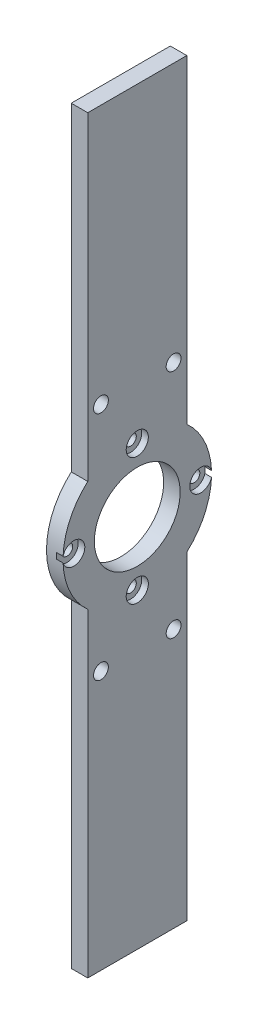
ISO-10303-21;
HEADER;
FILE_DESCRIPTION(('STEP AP214'),'2;1');
FILE_NAME('part.step','',(''),(''),'','','');
FILE_SCHEMA(('AUTOMOTIVE_DESIGN { 1 0 10303 214 1 1 1 1 }'));
ENDSEC;
DATA;
#1=APPLICATION_CONTEXT('core data for automotive mechanical design processes');
#2=APPLICATION_PROTOCOL_DEFINITION('international standard','automotive_design',2000,#1);
#3=PRODUCT_CONTEXT('',#1,'mechanical');
#4=PRODUCT('Part','Part','',(#3));
#5=PRODUCT_RELATED_PRODUCT_CATEGORY('part','',(#4));
#6=PRODUCT_DEFINITION_FORMATION('','',#4);
#7=PRODUCT_DEFINITION_CONTEXT('part definition',#1,'design');
#8=PRODUCT_DEFINITION('design','',#6,#7);
#9=PRODUCT_DEFINITION_SHAPE('','',#8);
#10=(LENGTH_UNIT() NAMED_UNIT(*) SI_UNIT(.MILLI.,.METRE.));
#11=(NAMED_UNIT(*) PLANE_ANGLE_UNIT() SI_UNIT($,.RADIAN.));
#12=(NAMED_UNIT(*) SI_UNIT($,.STERADIAN.) SOLID_ANGLE_UNIT());
#13=UNCERTAINTY_MEASURE_WITH_UNIT(LENGTH_MEASURE(1.E-05),#10,'distance_accuracy_value','');
#14=(GEOMETRIC_REPRESENTATION_CONTEXT(3) GLOBAL_UNCERTAINTY_ASSIGNED_CONTEXT((#13)) GLOBAL_UNIT_ASSIGNED_CONTEXT((#10,
#11,#12)) REPRESENTATION_CONTEXT('',''));
#15=CARTESIAN_POINT('',(0.,0.,0.));
#16=DIRECTION('',(0.,0.,1.));
#17=DIRECTION('',(1.,0.,0.));
#18=AXIS2_PLACEMENT_3D('',#15,#16,#17);
#19=CARTESIAN_POINT('',(0.,227.,30.));
#20=DIRECTION('',(0.,0.,-1.));
#21=DIRECTION('',(-1.,0.,0.));
#22=AXIS2_PLACEMENT_3D('',#19,#20,#21);
#23=PLANE('',#22);
#24=DIRECTION('',(0.,-1.,0.));
#25=VECTOR('',#24,1.);
#26=CARTESIAN_POINT('',(5.,227.,30.));
#27=LINE('',#26,#25);
#28=CARTESIAN_POINT('',(5.,96.7294901687516,30.));
#29=VERTEX_POINT('',#28);
#30=CARTESIAN_POINT('',(5.,0.,30.));
#31=VERTEX_POINT('',#30);
#32=EDGE_CURVE('E157',#29,#31,#27,.T.);
#33=ORIENTED_EDGE('',*,*,#32,.F.);
#34=DIRECTION('',(-1.,0.,0.));
#35=VECTOR('',#34,1.);
#36=CARTESIAN_POINT('',(68.6396103067893,96.7294901687516,30.));
#37=LINE('',#36,#35);
#38=CARTESIAN_POINT('',(0.,96.7294901687516,30.));
#39=VERTEX_POINT('',#38);
#40=EDGE_CURVE('E179',#29,#39,#37,.T.);
#41=ORIENTED_EDGE('',*,*,#40,.T.);
#42=DIRECTION('',(0.,-1.,0.));
#43=VECTOR('',#42,1.);
#44=CARTESIAN_POINT('',(0.,227.,30.));
#45=LINE('',#44,#43);
#46=CARTESIAN_POINT('',(0.,0.,30.));
#47=VERTEX_POINT('',#46);
#48=EDGE_CURVE('E153',#39,#47,#45,.T.);
#49=ORIENTED_EDGE('',*,*,#48,.T.);
#50=DIRECTION('',(1.,0.,0.));
#51=VECTOR('',#50,1.);
#52=CARTESIAN_POINT('',(0.,0.,30.));
#53=LINE('',#52,#51);
#54=EDGE_CURVE('E173',#47,#31,#53,.T.);
#55=ORIENTED_EDGE('',*,*,#54,.T.);
#56=EDGE_LOOP('',(#33,#41,#49,#55));
#57=FACE_BOUND('',#56,.T.);
#58=ADVANCED_FACE('F35',(#57),#23,.F.);
#59=CARTESIAN_POINT('',(0.,227.,0.));
#60=DIRECTION('',(0.,0.,1.));
#61=DIRECTION('',(1.,0.,0.));
#62=AXIS2_PLACEMENT_3D('',#59,#60,#61);
#63=PLANE('',#62);
#64=DIRECTION('',(0.,-1.,0.));
#65=VECTOR('',#64,1.);
#66=CARTESIAN_POINT('',(5.,227.,0.));
#67=LINE('',#66,#65);
#68=CARTESIAN_POINT('',(5.,227.,0.));
#69=VERTEX_POINT('',#68);
#70=CARTESIAN_POINT('',(5.,130.270509831248,0.));
#71=VERTEX_POINT('',#70);
#72=EDGE_CURVE('E158',#69,#71,#67,.T.);
#73=ORIENTED_EDGE('',*,*,#72,.T.);
#74=DIRECTION('',(-1.,0.,0.));
#75=VECTOR('',#74,1.);
#76=CARTESIAN_POINT('',(68.6396103067893,130.270509831248,0.));
#77=LINE('',#76,#75);
#78=CARTESIAN_POINT('',(0.,130.270509831248,0.));
#79=VERTEX_POINT('',#78);
#80=EDGE_CURVE('E145',#71,#79,#77,.T.);
#81=ORIENTED_EDGE('',*,*,#80,.T.);
#82=DIRECTION('',(0.,-1.,0.));
#83=VECTOR('',#82,1.);
#84=CARTESIAN_POINT('',(0.,227.,0.));
#85=LINE('',#84,#83);
#86=CARTESIAN_POINT('',(0.,227.,0.));
#87=VERTEX_POINT('',#86);
#88=EDGE_CURVE('E162',#87,#79,#85,.T.);
#89=ORIENTED_EDGE('',*,*,#88,.F.);
#90=DIRECTION('',(-1.,0.,0.));
#91=VECTOR('',#90,1.);
#92=CARTESIAN_POINT('',(0.,227.,0.));
#93=LINE('',#92,#91);
#94=EDGE_CURVE('E180',#69,#87,#93,.T.);
#95=ORIENTED_EDGE('',*,*,#94,.F.);
#96=EDGE_LOOP('',(#73,#81,#89,#95));
#97=FACE_BOUND('',#96,.T.);
#98=ADVANCED_FACE('F326',(#97),#63,.F.);
#99=CARTESIAN_POINT('',(0.,227.,0.));
#100=DIRECTION('',(1.,0.,0.));
#101=DIRECTION('',(0.,0.,-1.));
#102=AXIS2_PLACEMENT_3D('',#99,#100,#101);
#103=PLANE('',#102);
#104=CARTESIAN_POINT('',(0.,148.5,26.));
#105=DIRECTION('',(1.,0.,0.));
#106=DIRECTION('',(0.,0.,-1.));
#107=AXIS2_PLACEMENT_3D('',#104,#105,#106);
#108=CIRCLE('',#107,2.25);
#109=CARTESIAN_POINT('',(0.,148.5,23.75));
#110=VERTEX_POINT('',#109);
#111=EDGE_CURVE('E266',#110,#110,#108,.T.);
#112=ORIENTED_EDGE('',*,*,#111,.T.);
#113=EDGE_LOOP('',(#112));
#114=FACE_BOUND('',#113,.T.);
#115=CARTESIAN_POINT('',(0.,148.5,4.));
#116=DIRECTION('',(1.,0.,0.));
#117=DIRECTION('',(0.,0.,-1.));
#118=AXIS2_PLACEMENT_3D('',#115,#116,#117);
#119=CIRCLE('',#118,2.25);
#120=CARTESIAN_POINT('',(0.,148.5,1.75));
#121=VERTEX_POINT('',#120);
#122=EDGE_CURVE('E260',#121,#121,#119,.T.);
#123=ORIENTED_EDGE('',*,*,#122,.T.);
#124=EDGE_LOOP('',(#123));
#125=FACE_BOUND('',#124,.T.);
#126=CARTESIAN_POINT('',(0.,78.5,4.));
#127=DIRECTION('',(1.,0.,0.));
#128=DIRECTION('',(0.,0.,-1.));
#129=AXIS2_PLACEMENT_3D('',#126,#127,#128);
#130=CIRCLE('',#129,2.25);
#131=CARTESIAN_POINT('',(0.,78.5,1.75));
#132=VERTEX_POINT('',#131);
#133=EDGE_CURVE('E254',#132,#132,#130,.T.);
#134=ORIENTED_EDGE('',*,*,#133,.T.);
#135=EDGE_LOOP('',(#134));
#136=FACE_BOUND('',#135,.T.);
#137=CARTESIAN_POINT('',(0.,78.5,26.));
#138=DIRECTION('',(1.,0.,0.));
#139=DIRECTION('',(0.,0.,-1.));
#140=AXIS2_PLACEMENT_3D('',#137,#138,#139);
#141=CIRCLE('',#140,2.25);
#142=CARTESIAN_POINT('',(0.,78.5,23.75));
#143=VERTEX_POINT('',#142);
#144=EDGE_CURVE('E248',#143,#143,#141,.T.);
#145=ORIENTED_EDGE('',*,*,#144,.T.);
#146=EDGE_LOOP('',(#145));
#147=FACE_BOUND('',#146,.T.);
#148=CARTESIAN_POINT('',(0.,132.75,15.));
#149=DIRECTION('',(1.,0.,0.));
#150=DIRECTION('',(0.,0.,-1.));
#151=AXIS2_PLACEMENT_3D('',#148,#149,#150);
#152=CIRCLE('',#151,1.70000000000001);
#153=CARTESIAN_POINT('',(0.,132.75,13.3));
#154=VERTEX_POINT('',#153);
#155=EDGE_CURVE('E236',#154,#154,#152,.T.);
#156=ORIENTED_EDGE('',*,*,#155,.T.);
#157=EDGE_LOOP('',(#156));
#158=FACE_BOUND('',#157,.T.);
#159=CARTESIAN_POINT('',(0.,113.5,-4.25));
#160=DIRECTION('',(1.,0.,0.));
#161=DIRECTION('',(0.,0.,-1.));
#162=AXIS2_PLACEMENT_3D('',#159,#160,#161);
#163=CIRCLE('',#162,1.69999999999999);
#164=CARTESIAN_POINT('',(0.,113.5,-5.95));
#165=VERTEX_POINT('',#164);
#166=EDGE_CURVE('E230',#165,#165,#163,.T.);
#167=ORIENTED_EDGE('',*,*,#166,.T.);
#168=EDGE_LOOP('',(#167));
#169=FACE_BOUND('',#168,.T.);
#170=CARTESIAN_POINT('',(0.,94.25,15.));
#171=DIRECTION('',(1.,0.,0.));
#172=DIRECTION('',(0.,0.,-1.));
#173=AXIS2_PLACEMENT_3D('',#170,#171,#172);
#174=CIRCLE('',#173,1.69999999999999);
#175=CARTESIAN_POINT('',(0.,94.25,13.3));
#176=VERTEX_POINT('',#175);
#177=EDGE_CURVE('E218',#176,#176,#174,.T.);
#178=ORIENTED_EDGE('',*,*,#177,.T.);
#179=EDGE_LOOP('',(#178));
#180=FACE_BOUND('',#179,.T.);
#181=CARTESIAN_POINT('',(0.,113.5,34.25));
#182=DIRECTION('',(1.,0.,0.));
#183=DIRECTION('',(0.,0.,-1.));
#184=AXIS2_PLACEMENT_3D('',#181,#182,#183);
#185=CIRCLE('',#184,1.69999999999999);
#186=CARTESIAN_POINT('',(0.,113.5,32.55));
#187=VERTEX_POINT('',#186);
#188=EDGE_CURVE('E207',#187,#187,#185,.T.);
#189=ORIENTED_EDGE('',*,*,#188,.T.);
#190=EDGE_LOOP('',(#189));
#191=FACE_BOUND('',#190,.T.);
#192=CARTESIAN_POINT('',(0.,113.5,15.));
#193=DIRECTION('',(-1.,0.,0.));
#194=DIRECTION('',(0.,0.,1.));
#195=AXIS2_PLACEMENT_3D('',#192,#193,#194);
#196=CIRCLE('',#195,13.);
#197=CARTESIAN_POINT('',(0.,113.5,28.));
#198=VERTEX_POINT('',#197);
#199=EDGE_CURVE('E204',#198,#198,#196,.T.);
#200=ORIENTED_EDGE('',*,*,#199,.F.);
#201=EDGE_LOOP('',(#200));
#202=FACE_BOUND('',#201,.T.);
#203=ORIENTED_EDGE('',*,*,#48,.F.);
#204=CARTESIAN_POINT('',(0.,113.5,15.));
#205=DIRECTION('',(-1.,0.,0.));
#206=DIRECTION('',(0.,0.,1.));
#207=AXIS2_PLACEMENT_3D('',#204,#205,#206);
#208=CIRCLE('',#207,22.5);
#209=CARTESIAN_POINT('',(0.,130.270509831248,30.));
#210=VERTEX_POINT('',#209);
#211=EDGE_CURVE('E199',#39,#210,#208,.T.);
#212=ORIENTED_EDGE('',*,*,#211,.T.);
#213=CARTESIAN_POINT('',(0.,227.,30.));
#214=VERTEX_POINT('',#213);
#215=EDGE_CURVE('E150',#214,#210,#45,.T.);
#216=ORIENTED_EDGE('',*,*,#215,.F.);
#217=DIRECTION('',(0.,0.,1.));
#218=VECTOR('',#217,1.);
#219=CARTESIAN_POINT('',(0.,227.,0.));
#220=LINE('',#219,#218);
#221=EDGE_CURVE('E169',#87,#214,#220,.T.);
#222=ORIENTED_EDGE('',*,*,#221,.F.);
#223=ORIENTED_EDGE('',*,*,#88,.T.);
#224=CARTESIAN_POINT('',(0.,96.7294901687516,0.));
#225=VERTEX_POINT('',#224);
#226=EDGE_CURVE('E202',#79,#225,#208,.T.);
#227=ORIENTED_EDGE('',*,*,#226,.T.);
#228=CARTESIAN_POINT('',(0.,0.,0.));
#229=VERTEX_POINT('',#228);
#230=EDGE_CURVE('E165',#225,#229,#85,.T.);
#231=ORIENTED_EDGE('',*,*,#230,.T.);
#232=DIRECTION('',(0.,0.,1.));
#233=VECTOR('',#232,1.);
#234=CARTESIAN_POINT('',(0.,0.,0.));
#235=LINE('',#234,#233);
#236=EDGE_CURVE('E176',#229,#47,#235,.T.);
#237=ORIENTED_EDGE('',*,*,#236,.T.);
#238=EDGE_LOOP('',(#203,#212,#216,#222,#223,#227,#231,#237));
#239=FACE_BOUND('',#238,.T.);
#240=ADVANCED_FACE('F37',(#114,#125,#136,#147,#158,#169,#180,#191,#202,#239),#103,.F.);
#241=ORIENTED_EDGE('',*,*,#215,.T.);
#242=DIRECTION('',(-1.,0.,0.));
#243=VECTOR('',#242,1.);
#244=CARTESIAN_POINT('',(68.6396103067893,130.270509831248,30.));
#245=LINE('',#244,#243);
#246=CARTESIAN_POINT('',(5.,130.270509831248,30.));
#247=VERTEX_POINT('',#246);
#248=EDGE_CURVE('E190',#210,#247,#245,.F.);
#249=ORIENTED_EDGE('',*,*,#248,.T.);
#250=CARTESIAN_POINT('',(5.,227.,30.));
#251=VERTEX_POINT('',#250);
#252=EDGE_CURVE('E154',#251,#247,#27,.T.);
#253=ORIENTED_EDGE('',*,*,#252,.F.);
#254=DIRECTION('',(1.,0.,0.));
#255=VECTOR('',#254,1.);
#256=CARTESIAN_POINT('',(0.,227.,30.));
#257=LINE('',#256,#255);
#258=EDGE_CURVE('E184',#214,#251,#257,.T.);
#259=ORIENTED_EDGE('',*,*,#258,.F.);
#260=EDGE_LOOP('',(#241,#249,#253,#259));
#261=FACE_BOUND('',#260,.T.);
#262=ADVANCED_FACE('F279',(#261),#23,.F.);
#263=CARTESIAN_POINT('',(5.,227.,0.));
#264=DIRECTION('',(-1.,0.,0.));
#265=DIRECTION('',(0.,0.,1.));
#266=AXIS2_PLACEMENT_3D('',#263,#264,#265);
#267=PLANE('',#266);
#268=CARTESIAN_POINT('',(5.,148.5,26.));
#269=DIRECTION('',(1.,0.,0.));
#270=DIRECTION('',(0.,0.,-1.));
#271=AXIS2_PLACEMENT_3D('',#268,#269,#270);
#272=CIRCLE('',#271,2.25);
#273=CARTESIAN_POINT('',(5.,148.5,23.75));
#274=VERTEX_POINT('',#273);
#275=EDGE_CURVE('E269',#274,#274,#272,.T.);
#276=ORIENTED_EDGE('',*,*,#275,.F.);
#277=EDGE_LOOP('',(#276));
#278=FACE_BOUND('',#277,.T.);
#279=CARTESIAN_POINT('',(5.,148.5,4.));
#280=DIRECTION('',(1.,0.,0.));
#281=DIRECTION('',(0.,0.,-1.));
#282=AXIS2_PLACEMENT_3D('',#279,#280,#281);
#283=CIRCLE('',#282,2.25);
#284=CARTESIAN_POINT('',(5.,148.5,1.75));
#285=VERTEX_POINT('',#284);
#286=EDGE_CURVE('E263',#285,#285,#283,.T.);
#287=ORIENTED_EDGE('',*,*,#286,.F.);
#288=EDGE_LOOP('',(#287));
#289=FACE_BOUND('',#288,.T.);
#290=CARTESIAN_POINT('',(5.,78.5,4.));
#291=DIRECTION('',(1.,0.,0.));
#292=DIRECTION('',(0.,0.,-1.));
#293=AXIS2_PLACEMENT_3D('',#290,#291,#292);
#294=CIRCLE('',#293,2.25);
#295=CARTESIAN_POINT('',(5.,78.5,1.75));
#296=VERTEX_POINT('',#295);
#297=EDGE_CURVE('E257',#296,#296,#294,.T.);
#298=ORIENTED_EDGE('',*,*,#297,.F.);
#299=EDGE_LOOP('',(#298));
#300=FACE_BOUND('',#299,.T.);
#301=CARTESIAN_POINT('',(5.,78.5,26.));
#302=DIRECTION('',(1.,0.,0.));
#303=DIRECTION('',(0.,0.,-1.));
#304=AXIS2_PLACEMENT_3D('',#301,#302,#303);
#305=CIRCLE('',#304,2.25);
#306=CARTESIAN_POINT('',(5.,78.5,23.75));
#307=VERTEX_POINT('',#306);
#308=EDGE_CURVE('E251',#307,#307,#305,.T.);
#309=ORIENTED_EDGE('',*,*,#308,.F.);
#310=EDGE_LOOP('',(#309));
#311=FACE_BOUND('',#310,.T.);
#312=CARTESIAN_POINT('',(5.,132.75,15.));
#313=DIRECTION('',(1.,0.,0.));
#314=DIRECTION('',(0.,0.,-1.));
#315=AXIS2_PLACEMENT_3D('',#312,#313,#314);
#316=CIRCLE('',#315,3.34999999999999);
#317=CARTESIAN_POINT('',(5.,132.75,11.65));
#318=VERTEX_POINT('',#317);
#319=EDGE_CURVE('E245',#318,#318,#316,.T.);
#320=ORIENTED_EDGE('',*,*,#319,.F.);
#321=EDGE_LOOP('',(#320));
#322=FACE_BOUND('',#321,.T.);
#323=CARTESIAN_POINT('',(5.,94.25,15.));
#324=DIRECTION('',(1.,0.,0.));
#325=DIRECTION('',(0.,0.,-1.));
#326=AXIS2_PLACEMENT_3D('',#323,#324,#325);
#327=CIRCLE('',#326,3.34999999999999);
#328=CARTESIAN_POINT('',(5.,94.25,11.65));
#329=VERTEX_POINT('',#328);
#330=EDGE_CURVE('E227',#329,#329,#327,.T.);
#331=ORIENTED_EDGE('',*,*,#330,.F.);
#332=EDGE_LOOP('',(#331));
#333=FACE_BOUND('',#332,.T.);
#334=CARTESIAN_POINT('',(5.00000000000001,113.5,15.));
#335=DIRECTION('',(-1.,0.,0.));
#336=DIRECTION('',(0.,0.,1.));
#337=AXIS2_PLACEMENT_3D('',#334,#335,#336);
#338=CIRCLE('',#337,13.);
#339=CARTESIAN_POINT('',(5.00000000000001,113.5,28.));
#340=VERTEX_POINT('',#339);
#341=EDGE_CURVE('E203',#340,#340,#338,.T.);
#342=ORIENTED_EDGE('',*,*,#341,.T.);
#343=EDGE_LOOP('',(#342));
#344=FACE_BOUND('',#343,.T.);
#345=CARTESIAN_POINT('',(5.,113.5,15.));
#346=DIRECTION('',(-1.,0.,0.));
#347=DIRECTION('',(0.,0.,1.));
#348=AXIS2_PLACEMENT_3D('',#345,#346,#347);
#349=CIRCLE('',#348,22.5);
#350=CARTESIAN_POINT('',(5.,96.7294901687516,0.));
#351=VERTEX_POINT('',#350);
#352=CARTESIAN_POINT('',(5.,112.621857247438,-7.48285714285715));
#353=VERTEX_POINT('',#352);
#354=EDGE_CURVE('E193',#351,#353,#349,.F.);
#355=ORIENTED_EDGE('',*,*,#354,.T.);
#356=CARTESIAN_POINT('',(5.,113.5,-4.25));
#357=DIRECTION('',(1.,0.,0.));
#358=DIRECTION('',(0.,0.,-1.));
#359=AXIS2_PLACEMENT_3D('',#356,#357,#358);
#360=CIRCLE('',#359,3.34999999999999);
#361=CARTESIAN_POINT('',(5.,114.378142752562,-7.48285714285715));
#362=VERTEX_POINT('',#361);
#363=EDGE_CURVE('E123',#362,#353,#360,.T.);
#364=ORIENTED_EDGE('',*,*,#363,.F.);
#365=EDGE_CURVE('E197',#362,#71,#349,.F.);
#366=ORIENTED_EDGE('',*,*,#365,.T.);
#367=ORIENTED_EDGE('',*,*,#72,.F.);
#368=DIRECTION('',(0.,0.,-1.));
#369=VECTOR('',#368,1.);
#370=CARTESIAN_POINT('',(5.,227.,0.));
#371=LINE('',#370,#369);
#372=EDGE_CURVE('E182',#251,#69,#371,.T.);
#373=ORIENTED_EDGE('',*,*,#372,.F.);
#374=ORIENTED_EDGE('',*,*,#252,.T.);
#375=CARTESIAN_POINT('',(5.,114.378142752562,37.4828571428571));
#376=VERTEX_POINT('',#375);
#377=EDGE_CURVE('E194',#247,#376,#349,.F.);
#378=ORIENTED_EDGE('',*,*,#377,.T.);
#379=CARTESIAN_POINT('',(5.,113.5,34.25));
#380=DIRECTION('',(1.,0.,0.));
#381=DIRECTION('',(0.,0.,-1.));
#382=AXIS2_PLACEMENT_3D('',#379,#380,#381);
#383=CIRCLE('',#382,3.34999999999999);
#384=CARTESIAN_POINT('',(5.,112.621857247438,37.4828571428571));
#385=VERTEX_POINT('',#384);
#386=EDGE_CURVE('E216',#385,#376,#383,.T.);
#387=ORIENTED_EDGE('',*,*,#386,.F.);
#388=EDGE_CURVE('E198',#385,#29,#349,.F.);
#389=ORIENTED_EDGE('',*,*,#388,.T.);
#390=ORIENTED_EDGE('',*,*,#32,.T.);
#391=DIRECTION('',(0.,0.,-1.));
#392=VECTOR('',#391,1.);
#393=CARTESIAN_POINT('',(5.,0.,0.));
#394=LINE('',#393,#392);
#395=CARTESIAN_POINT('',(5.,0.,0.));
#396=VERTEX_POINT('',#395);
#397=EDGE_CURVE('E170',#31,#396,#394,.T.);
#398=ORIENTED_EDGE('',*,*,#397,.T.);
#399=EDGE_CURVE('E161',#351,#396,#67,.T.);
#400=ORIENTED_EDGE('',*,*,#399,.F.);
#401=EDGE_LOOP('',(#355,#364,#366,#367,#373,#374,#378,#387,#389,#390,#398,#400));
#402=FACE_BOUND('',#401,.T.);
#403=ADVANCED_FACE('F275',(#278,#289,#300,#311,#322,#333,#344,#402),#267,.F.);
#404=ORIENTED_EDGE('',*,*,#230,.F.);
#405=DIRECTION('',(-1.,0.,0.));
#406=VECTOR('',#405,1.);
#407=CARTESIAN_POINT('',(68.6396103067893,96.7294901687516,0.));
#408=LINE('',#407,#406);
#409=EDGE_CURVE('E147',#225,#351,#408,.F.);
#410=ORIENTED_EDGE('',*,*,#409,.T.);
#411=ORIENTED_EDGE('',*,*,#399,.T.);
#412=DIRECTION('',(-1.,0.,0.));
#413=VECTOR('',#412,1.);
#414=CARTESIAN_POINT('',(0.,0.,0.));
#415=LINE('',#414,#413);
#416=EDGE_CURVE('E166',#396,#229,#415,.T.);
#417=ORIENTED_EDGE('',*,*,#416,.T.);
#418=EDGE_LOOP('',(#404,#410,#411,#417));
#419=FACE_BOUND('',#418,.T.);
#420=ADVANCED_FACE('F278',(#419),#63,.F.);
#421=CARTESIAN_POINT('',(0.,227.,0.));
#422=DIRECTION('',(0.,1.,0.));
#423=DIRECTION('',(0.,0.,1.));
#424=AXIS2_PLACEMENT_3D('',#421,#422,#423);
#425=PLANE('',#424);
#426=ORIENTED_EDGE('',*,*,#221,.T.);
#427=ORIENTED_EDGE('',*,*,#258,.T.);
#428=ORIENTED_EDGE('',*,*,#372,.T.);
#429=ORIENTED_EDGE('',*,*,#94,.T.);
#430=EDGE_LOOP('',(#426,#427,#428,#429));
#431=FACE_BOUND('',#430,.T.);
#432=ADVANCED_FACE('F324',(#431),#425,.T.);
#433=CARTESIAN_POINT('',(0.,0.,0.));
#434=DIRECTION('',(0.,1.,0.));
#435=DIRECTION('',(0.,0.,1.));
#436=AXIS2_PLACEMENT_3D('',#433,#434,#435);
#437=PLANE('',#436);
#438=ORIENTED_EDGE('',*,*,#236,.F.);
#439=ORIENTED_EDGE('',*,*,#416,.F.);
#440=ORIENTED_EDGE('',*,*,#397,.F.);
#441=ORIENTED_EDGE('',*,*,#54,.F.);
#442=EDGE_LOOP('',(#438,#439,#440,#441));
#443=FACE_BOUND('',#442,.T.);
#444=ADVANCED_FACE('F310',(#443),#437,.F.);
#445=CARTESIAN_POINT('',(68.6396103067893,113.5,15.));
#446=DIRECTION('',(-1.,0.,0.));
#447=DIRECTION('',(0.,0.,1.));
#448=AXIS2_PLACEMENT_3D('',#445,#446,#447);
#449=CYLINDRICAL_SURFACE('',#448,22.5);
#450=DIRECTION('',(1.,0.,0.));
#451=VECTOR('',#450,1.);
#452=CARTESIAN_POINT('',(4.,112.621857247438,-7.48285714285715));
#453=LINE('',#452,#451);
#454=CARTESIAN_POINT('',(3.,112.621857247438,-7.48285714285715));
#455=VERTEX_POINT('',#454);
#456=EDGE_CURVE('E11',#353,#455,#453,.F.);
#457=ORIENTED_EDGE('',*,*,#456,.F.);
#458=ORIENTED_EDGE('',*,*,#354,.F.);
#459=ORIENTED_EDGE('',*,*,#409,.F.);
#460=ORIENTED_EDGE('',*,*,#226,.F.);
#461=ORIENTED_EDGE('',*,*,#80,.F.);
#462=ORIENTED_EDGE('',*,*,#365,.F.);
#463=DIRECTION('',(1.,0.,0.));
#464=VECTOR('',#463,1.);
#465=CARTESIAN_POINT('',(4.,114.378142752562,-7.48285714285715));
#466=LINE('',#465,#464);
#467=CARTESIAN_POINT('',(3.,114.378142752562,-7.48285714285715));
#468=VERTEX_POINT('',#467);
#469=EDGE_CURVE('E136',#468,#362,#466,.T.);
#470=ORIENTED_EDGE('',*,*,#469,.F.);
#471=CARTESIAN_POINT('',(3.,113.5,15.));
#472=DIRECTION('',(-1.,0.,0.));
#473=DIRECTION('',(0.,0.,1.));
#474=AXIS2_PLACEMENT_3D('',#471,#472,#473);
#475=CIRCLE('',#474,22.5);
#476=EDGE_CURVE('E43',#455,#468,#475,.F.);
#477=ORIENTED_EDGE('',*,*,#476,.F.);
#478=EDGE_LOOP('',(#457,#458,#459,#460,#461,#462,#470,#477));
#479=FACE_BOUND('',#478,.T.);
#480=ADVANCED_FACE('F134',(#479),#449,.T.);
#481=DIRECTION('',(1.,0.,0.));
#482=VECTOR('',#481,1.);
#483=CARTESIAN_POINT('',(4.,114.378142752562,37.4828571428571));
#484=LINE('',#483,#482);
#485=CARTESIAN_POINT('',(3.,114.378142752562,37.4828571428571));
#486=VERTEX_POINT('',#485);
#487=EDGE_CURVE('E137',#376,#486,#484,.F.);
#488=ORIENTED_EDGE('',*,*,#487,.F.);
#489=ORIENTED_EDGE('',*,*,#377,.F.);
#490=ORIENTED_EDGE('',*,*,#248,.F.);
#491=ORIENTED_EDGE('',*,*,#211,.F.);
#492=ORIENTED_EDGE('',*,*,#40,.F.);
#493=ORIENTED_EDGE('',*,*,#388,.F.);
#494=DIRECTION('',(1.,0.,0.));
#495=VECTOR('',#494,1.);
#496=CARTESIAN_POINT('',(4.,112.621857247438,37.4828571428571));
#497=LINE('',#496,#495);
#498=CARTESIAN_POINT('',(3.,112.621857247438,37.4828571428571));
#499=VERTEX_POINT('',#498);
#500=EDGE_CURVE('E143',#499,#385,#497,.T.);
#501=ORIENTED_EDGE('',*,*,#500,.F.);
#502=CARTESIAN_POINT('',(3.,113.5,15.));
#503=DIRECTION('',(-1.,0.,0.));
#504=DIRECTION('',(0.,0.,1.));
#505=AXIS2_PLACEMENT_3D('',#502,#503,#504);
#506=CIRCLE('',#505,22.5);
#507=EDGE_CURVE('E141',#486,#499,#506,.F.);
#508=ORIENTED_EDGE('',*,*,#507,.F.);
#509=EDGE_LOOP('',(#488,#489,#490,#491,#492,#493,#501,#508));
#510=FACE_BOUND('',#509,.T.);
#511=ADVANCED_FACE('F316',(#510),#449,.T.);
#512=CARTESIAN_POINT('',(5.00000000000001,113.5,15.));
#513=DIRECTION('',(-1.,0.,0.));
#514=DIRECTION('',(0.,0.,1.));
#515=AXIS2_PLACEMENT_3D('',#512,#513,#514);
#516=CYLINDRICAL_SURFACE('',#515,13.);
#517=ORIENTED_EDGE('',*,*,#341,.F.);
#518=EDGE_LOOP('',(#517));
#519=FACE_BOUND('',#518,.T.);
#520=ORIENTED_EDGE('',*,*,#199,.T.);
#521=EDGE_LOOP('',(#520));
#522=FACE_BOUND('',#521,.T.);
#523=ADVANCED_FACE('F346',(#519,#522),#516,.F.);
#524=CARTESIAN_POINT('',(5.,113.5,34.25));
#525=DIRECTION('',(1.,0.,0.));
#526=DIRECTION('',(0.,0.,-1.));
#527=AXIS2_PLACEMENT_3D('',#524,#525,#526);
#528=CYLINDRICAL_SURFACE('',#527,1.7);
#529=ORIENTED_EDGE('',*,*,#188,.F.);
#530=EDGE_LOOP('',(#529));
#531=FACE_BOUND('',#530,.T.);
#532=CARTESIAN_POINT('',(3.,113.5,34.25));
#533=DIRECTION('',(1.,0.,0.));
#534=DIRECTION('',(0.,0.,-1.));
#535=AXIS2_PLACEMENT_3D('',#532,#533,#534);
#536=CIRCLE('',#535,1.70000000000001);
#537=CARTESIAN_POINT('',(3.,113.5,32.5499999999999));
#538=VERTEX_POINT('',#537);
#539=EDGE_CURVE('E212',#538,#538,#536,.T.);
#540=ORIENTED_EDGE('',*,*,#539,.T.);
#541=EDGE_LOOP('',(#540));
#542=FACE_BOUND('',#541,.T.);
#543=ADVANCED_FACE('F349',(#531,#542),#528,.F.);
#544=CARTESIAN_POINT('',(3.,115.2,34.25));
#545=DIRECTION('',(-1.,0.,0.));
#546=DIRECTION('',(0.,0.,1.));
#547=AXIS2_PLACEMENT_3D('',#544,#545,#546);
#548=PLANE('',#547);
#549=ORIENTED_EDGE('',*,*,#507,.T.);
#550=CARTESIAN_POINT('',(3.,113.5,34.25));
#551=DIRECTION('',(1.,0.,0.));
#552=DIRECTION('',(0.,0.,-1.));
#553=AXIS2_PLACEMENT_3D('',#550,#551,#552);
#554=CIRCLE('',#553,3.34999999999999);
#555=EDGE_CURVE('E57',#499,#486,#554,.T.);
#556=ORIENTED_EDGE('',*,*,#555,.T.);
#557=EDGE_LOOP('',(#549,#556));
#558=FACE_BOUND('',#557,.T.);
#559=ORIENTED_EDGE('',*,*,#539,.F.);
#560=EDGE_LOOP('',(#559));
#561=FACE_BOUND('',#560,.T.);
#562=ADVANCED_FACE('F353',(#558,#561),#548,.F.);
#563=CARTESIAN_POINT('',(5.,113.5,34.25));
#564=DIRECTION('',(1.,0.,0.));
#565=DIRECTION('',(0.,0.,-1.));
#566=AXIS2_PLACEMENT_3D('',#563,#564,#565);
#567=CYLINDRICAL_SURFACE('',#566,3.34999999999999);
#568=ORIENTED_EDGE('',*,*,#487,.T.);
#569=ORIENTED_EDGE('',*,*,#555,.F.);
#570=ORIENTED_EDGE('',*,*,#500,.T.);
#571=ORIENTED_EDGE('',*,*,#386,.T.);
#572=EDGE_LOOP('',(#568,#569,#570,#571));
#573=FACE_BOUND('',#572,.T.);
#574=ADVANCED_FACE('F357',(#573),#567,.F.);
#575=CARTESIAN_POINT('',(5.,94.25,15.));
#576=DIRECTION('',(1.,0.,0.));
#577=DIRECTION('',(0.,0.,-1.));
#578=AXIS2_PLACEMENT_3D('',#575,#576,#577);
#579=CYLINDRICAL_SURFACE('',#578,1.7);
#580=ORIENTED_EDGE('',*,*,#177,.F.);
#581=EDGE_LOOP('',(#580));
#582=FACE_BOUND('',#581,.T.);
#583=CARTESIAN_POINT('',(3.,94.25,15.));
#584=DIRECTION('',(1.,0.,0.));
#585=DIRECTION('',(0.,0.,-1.));
#586=AXIS2_PLACEMENT_3D('',#583,#584,#585);
#587=CIRCLE('',#586,1.70000000000001);
#588=CARTESIAN_POINT('',(3.,94.25,13.3));
#589=VERTEX_POINT('',#588);
#590=EDGE_CURVE('E221',#589,#589,#587,.T.);
#591=ORIENTED_EDGE('',*,*,#590,.T.);
#592=EDGE_LOOP('',(#591));
#593=FACE_BOUND('',#592,.T.);
#594=ADVANCED_FACE('F361',(#582,#593),#579,.F.);
#595=CARTESIAN_POINT('',(3.,95.95,15.));
#596=DIRECTION('',(-1.,0.,0.));
#597=DIRECTION('',(0.,0.,1.));
#598=AXIS2_PLACEMENT_3D('',#595,#596,#597);
#599=PLANE('',#598);
#600=ORIENTED_EDGE('',*,*,#590,.F.);
#601=EDGE_LOOP('',(#600));
#602=FACE_BOUND('',#601,.T.);
#603=CARTESIAN_POINT('',(3.,94.25,15.));
#604=DIRECTION('',(1.,0.,0.));
#605=DIRECTION('',(0.,0.,-1.));
#606=AXIS2_PLACEMENT_3D('',#603,#604,#605);
#607=CIRCLE('',#606,3.34999999999999);
#608=CARTESIAN_POINT('',(3.,94.25,11.65));
#609=VERTEX_POINT('',#608);
#610=EDGE_CURVE('E224',#609,#609,#607,.T.);
#611=ORIENTED_EDGE('',*,*,#610,.T.);
#612=EDGE_LOOP('',(#611));
#613=FACE_BOUND('',#612,.T.);
#614=ADVANCED_FACE('F364',(#602,#613),#599,.F.);
#615=CARTESIAN_POINT('',(5.,94.25,15.));
#616=DIRECTION('',(1.,0.,0.));
#617=DIRECTION('',(0.,0.,-1.));
#618=AXIS2_PLACEMENT_3D('',#615,#616,#617);
#619=CYLINDRICAL_SURFACE('',#618,3.34999999999999);
#620=ORIENTED_EDGE('',*,*,#610,.F.);
#621=EDGE_LOOP('',(#620));
#622=FACE_BOUND('',#621,.T.);
#623=ORIENTED_EDGE('',*,*,#330,.T.);
#624=EDGE_LOOP('',(#623));
#625=FACE_BOUND('',#624,.T.);
#626=ADVANCED_FACE('F368',(#622,#625),#619,.F.);
#627=CARTESIAN_POINT('',(5.,113.5,-4.25));
#628=DIRECTION('',(1.,0.,0.));
#629=DIRECTION('',(0.,0.,-1.));
#630=AXIS2_PLACEMENT_3D('',#627,#628,#629);
#631=CYLINDRICAL_SURFACE('',#630,1.7);
#632=ORIENTED_EDGE('',*,*,#166,.F.);
#633=EDGE_LOOP('',(#632));
#634=FACE_BOUND('',#633,.T.);
#635=CARTESIAN_POINT('',(3.,113.5,-4.25));
#636=DIRECTION('',(1.,0.,0.));
#637=DIRECTION('',(0.,0.,-1.));
#638=AXIS2_PLACEMENT_3D('',#635,#636,#637);
#639=CIRCLE('',#638,1.70000000000001);
#640=CARTESIAN_POINT('',(3.,113.5,-5.95000000000001));
#641=VERTEX_POINT('',#640);
#642=EDGE_CURVE('E132',#641,#641,#639,.T.);
#643=ORIENTED_EDGE('',*,*,#642,.T.);
#644=EDGE_LOOP('',(#643));
#645=FACE_BOUND('',#644,.T.);
#646=ADVANCED_FACE('F372',(#634,#645),#631,.F.);
#647=CARTESIAN_POINT('',(3.,115.2,-4.25));
#648=DIRECTION('',(-1.,0.,0.));
#649=DIRECTION('',(0.,0.,1.));
#650=AXIS2_PLACEMENT_3D('',#647,#648,#649);
#651=PLANE('',#650);
#652=ORIENTED_EDGE('',*,*,#476,.T.);
#653=CARTESIAN_POINT('',(3.,113.5,-4.25));
#654=DIRECTION('',(1.,0.,0.));
#655=DIRECTION('',(0.,0.,-1.));
#656=AXIS2_PLACEMENT_3D('',#653,#654,#655);
#657=CIRCLE('',#656,3.34999999999999);
#658=EDGE_CURVE('E49',#468,#455,#657,.T.);
#659=ORIENTED_EDGE('',*,*,#658,.T.);
#660=EDGE_LOOP('',(#652,#659));
#661=FACE_BOUND('',#660,.T.);
#662=ORIENTED_EDGE('',*,*,#642,.F.);
#663=EDGE_LOOP('',(#662));
#664=FACE_BOUND('',#663,.T.);
#665=ADVANCED_FACE('F129',(#661,#664),#651,.F.);
#666=CARTESIAN_POINT('',(5.,113.5,-4.25));
#667=DIRECTION('',(1.,0.,0.));
#668=DIRECTION('',(0.,0.,-1.));
#669=AXIS2_PLACEMENT_3D('',#666,#667,#668);
#670=CYLINDRICAL_SURFACE('',#669,3.34999999999999);
#671=ORIENTED_EDGE('',*,*,#456,.T.);
#672=ORIENTED_EDGE('',*,*,#658,.F.);
#673=ORIENTED_EDGE('',*,*,#469,.T.);
#674=ORIENTED_EDGE('',*,*,#363,.T.);
#675=EDGE_LOOP('',(#671,#672,#673,#674));
#676=FACE_BOUND('',#675,.T.);
#677=ADVANCED_FACE('F121',(#676),#670,.F.);
#678=CARTESIAN_POINT('',(5.,132.75,15.));
#679=DIRECTION('',(1.,0.,0.));
#680=DIRECTION('',(0.,0.,-1.));
#681=AXIS2_PLACEMENT_3D('',#678,#679,#680);
#682=CYLINDRICAL_SURFACE('',#681,1.70000000000001);
#683=ORIENTED_EDGE('',*,*,#155,.F.);
#684=EDGE_LOOP('',(#683));
#685=FACE_BOUND('',#684,.T.);
#686=CARTESIAN_POINT('',(3.,132.75,15.));
#687=DIRECTION('',(1.,0.,0.));
#688=DIRECTION('',(0.,0.,-1.));
#689=AXIS2_PLACEMENT_3D('',#686,#687,#688);
#690=CIRCLE('',#689,1.70000000000001);
#691=CARTESIAN_POINT('',(3.,132.75,13.3));
#692=VERTEX_POINT('',#691);
#693=EDGE_CURVE('E239',#692,#692,#690,.T.);
#694=ORIENTED_EDGE('',*,*,#693,.T.);
#695=EDGE_LOOP('',(#694));
#696=FACE_BOUND('',#695,.T.);
#697=ADVANCED_FACE('F381',(#685,#696),#682,.F.);
#698=CARTESIAN_POINT('',(3.,134.45,15.));
#699=DIRECTION('',(-1.,0.,0.));
#700=DIRECTION('',(0.,0.,1.));
#701=AXIS2_PLACEMENT_3D('',#698,#699,#700);
#702=PLANE('',#701);
#703=ORIENTED_EDGE('',*,*,#693,.F.);
#704=EDGE_LOOP('',(#703));
#705=FACE_BOUND('',#704,.T.);
#706=CARTESIAN_POINT('',(3.,132.75,15.));
#707=DIRECTION('',(1.,0.,0.));
#708=DIRECTION('',(0.,0.,-1.));
#709=AXIS2_PLACEMENT_3D('',#706,#707,#708);
#710=CIRCLE('',#709,3.34999999999999);
#711=CARTESIAN_POINT('',(3.,132.75,11.65));
#712=VERTEX_POINT('',#711);
#713=EDGE_CURVE('E242',#712,#712,#710,.T.);
#714=ORIENTED_EDGE('',*,*,#713,.T.);
#715=EDGE_LOOP('',(#714));
#716=FACE_BOUND('',#715,.T.);
#717=ADVANCED_FACE('F384',(#705,#716),#702,.F.);
#718=CARTESIAN_POINT('',(5.,132.75,15.));
#719=DIRECTION('',(1.,0.,0.));
#720=DIRECTION('',(0.,0.,-1.));
#721=AXIS2_PLACEMENT_3D('',#718,#719,#720);
#722=CYLINDRICAL_SURFACE('',#721,3.34999999999999);
#723=ORIENTED_EDGE('',*,*,#713,.F.);
#724=EDGE_LOOP('',(#723));
#725=FACE_BOUND('',#724,.T.);
#726=ORIENTED_EDGE('',*,*,#319,.T.);
#727=EDGE_LOOP('',(#726));
#728=FACE_BOUND('',#727,.T.);
#729=ADVANCED_FACE('F388',(#725,#728),#722,.F.);
#730=CARTESIAN_POINT('',(5.,78.5,26.));
#731=DIRECTION('',(1.,0.,0.));
#732=DIRECTION('',(0.,0.,-1.));
#733=AXIS2_PLACEMENT_3D('',#730,#731,#732);
#734=CYLINDRICAL_SURFACE('',#733,2.25);
#735=ORIENTED_EDGE('',*,*,#144,.F.);
#736=EDGE_LOOP('',(#735));
#737=FACE_BOUND('',#736,.T.);
#738=ORIENTED_EDGE('',*,*,#308,.T.);
#739=EDGE_LOOP('',(#738));
#740=FACE_BOUND('',#739,.T.);
#741=ADVANCED_FACE('F392',(#737,#740),#734,.F.);
#742=CARTESIAN_POINT('',(5.,78.5,4.));
#743=DIRECTION('',(1.,0.,0.));
#744=DIRECTION('',(0.,0.,-1.));
#745=AXIS2_PLACEMENT_3D('',#742,#743,#744);
#746=CYLINDRICAL_SURFACE('',#745,2.25);
#747=ORIENTED_EDGE('',*,*,#133,.F.);
#748=EDGE_LOOP('',(#747));
#749=FACE_BOUND('',#748,.T.);
#750=ORIENTED_EDGE('',*,*,#297,.T.);
#751=EDGE_LOOP('',(#750));
#752=FACE_BOUND('',#751,.T.);
#753=ADVANCED_FACE('F396',(#749,#752),#746,.F.);
#754=CARTESIAN_POINT('',(5.,148.5,4.));
#755=DIRECTION('',(1.,0.,0.));
#756=DIRECTION('',(0.,0.,-1.));
#757=AXIS2_PLACEMENT_3D('',#754,#755,#756);
#758=CYLINDRICAL_SURFACE('',#757,2.25);
#759=ORIENTED_EDGE('',*,*,#122,.F.);
#760=EDGE_LOOP('',(#759));
#761=FACE_BOUND('',#760,.T.);
#762=ORIENTED_EDGE('',*,*,#286,.T.);
#763=EDGE_LOOP('',(#762));
#764=FACE_BOUND('',#763,.T.);
#765=ADVANCED_FACE('F400',(#761,#764),#758,.F.);
#766=CARTESIAN_POINT('',(5.,148.5,26.));
#767=DIRECTION('',(1.,0.,0.));
#768=DIRECTION('',(0.,0.,-1.));
#769=AXIS2_PLACEMENT_3D('',#766,#767,#768);
#770=CYLINDRICAL_SURFACE('',#769,2.25);
#771=ORIENTED_EDGE('',*,*,#111,.F.);
#772=EDGE_LOOP('',(#771));
#773=FACE_BOUND('',#772,.T.);
#774=ORIENTED_EDGE('',*,*,#275,.T.);
#775=EDGE_LOOP('',(#774));
#776=FACE_BOUND('',#775,.T.);
#777=ADVANCED_FACE('F273',(#773,#776),#770,.F.);
#778=CLOSED_SHELL('',(#58,#98,#240,#262,#403,#420,#432,#444,#480,#511,#523,#543,#562,#574,#594,
#614,#626,#646,#665,#677,#697,#717,#729,#741,#753,#765,#777));
#779=MANIFOLD_SOLID_BREP('B2',#778);
#780=ADVANCED_BREP_SHAPE_REPRESENTATION('',(#18,#779),#14);
#781=SHAPE_DEFINITION_REPRESENTATION(#9,#780);
ENDSEC;
END-ISO-10303-21;
